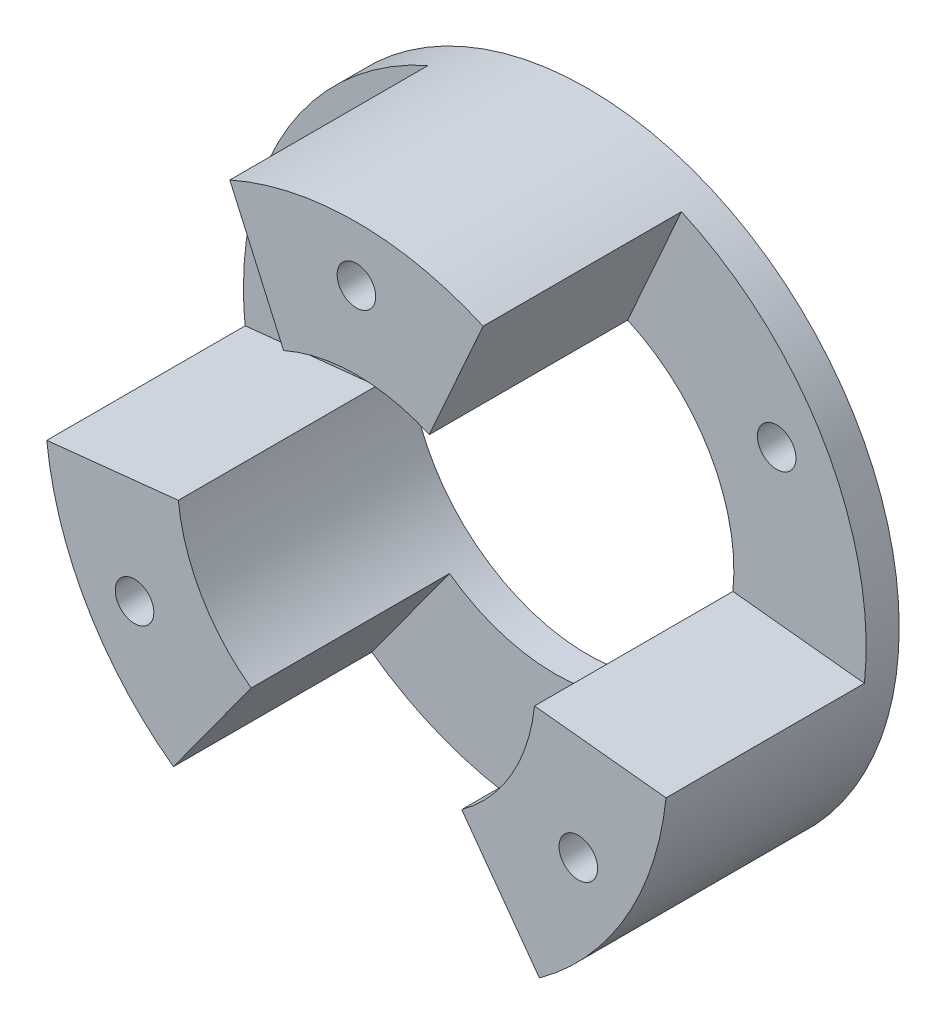
ISO-10303-21;
HEADER;
FILE_DESCRIPTION(('STEP AP214'),'2;1');
FILE_NAME('part.step','',(''),(''),'','','');
FILE_SCHEMA(('AUTOMOTIVE_DESIGN { 1 0 10303 214 1 1 1 1 }'));
ENDSEC;
DATA;
#1=APPLICATION_CONTEXT('core data for automotive mechanical design processes');
#2=APPLICATION_PROTOCOL_DEFINITION('international standard','automotive_design',2000,#1);
#3=PRODUCT_CONTEXT('',#1,'mechanical');
#4=PRODUCT('Part','Part','',(#3));
#5=PRODUCT_RELATED_PRODUCT_CATEGORY('part','',(#4));
#6=PRODUCT_DEFINITION_FORMATION('','',#4);
#7=PRODUCT_DEFINITION_CONTEXT('part definition',#1,'design');
#8=PRODUCT_DEFINITION('design','',#6,#7);
#9=PRODUCT_DEFINITION_SHAPE('','',#8);
#10=(LENGTH_UNIT() NAMED_UNIT(*) SI_UNIT(.MILLI.,.METRE.));
#11=(NAMED_UNIT(*) PLANE_ANGLE_UNIT() SI_UNIT($,.RADIAN.));
#12=(NAMED_UNIT(*) SI_UNIT($,.STERADIAN.) SOLID_ANGLE_UNIT());
#13=UNCERTAINTY_MEASURE_WITH_UNIT(LENGTH_MEASURE(1.E-05),#10,'distance_accuracy_value','');
#14=(GEOMETRIC_REPRESENTATION_CONTEXT(3) GLOBAL_UNCERTAINTY_ASSIGNED_CONTEXT((#13)) GLOBAL_UNIT_ASSIGNED_CONTEXT((#10,
#11,#12)) REPRESENTATION_CONTEXT('',''));
#15=CARTESIAN_POINT('',(0.,0.,0.));
#16=DIRECTION('',(0.,0.,1.));
#17=DIRECTION('',(1.,0.,0.));
#18=AXIS2_PLACEMENT_3D('',#15,#16,#17);
#19=CARTESIAN_POINT('',(0.,28.25,3.));
#20=DIRECTION('',(0.,0.,1.));
#21=DIRECTION('',(1.,0.,0.));
#22=AXIS2_PLACEMENT_3D('',#19,#20,#21);
#23=PLANE('',#22);
#24=CARTESIAN_POINT('',(0.,-23.25,3.));
#25=DIRECTION('',(0.,0.,1.));
#26=DIRECTION('',(1.,0.,0.));
#27=AXIS2_PLACEMENT_3D('',#24,#25,#26);
#28=CIRCLE('',#27,1.75);
#29=CARTESIAN_POINT('',(1.75,-23.25,3.));
#30=VERTEX_POINT('',#29);
#31=EDGE_CURVE('E301',#30,#30,#28,.T.);
#32=ORIENTED_EDGE('',*,*,#31,.F.);
#33=EDGE_LOOP('',(#32));
#34=FACE_BOUND('',#33,.T.);
#35=CARTESIAN_POINT('',(0.,0.,3.));
#36=DIRECTION('',(0.,0.,-1.));
#37=DIRECTION('',(-1.,0.,0.));
#38=AXIS2_PLACEMENT_3D('',#35,#36,#37);
#39=CIRCLE('',#38,16.25);
#40=CARTESIAN_POINT('',(9.55151034975261,-13.146526158593,3.));
#41=VERTEX_POINT('',#40);
#42=CARTESIAN_POINT('',(-9.5515103497528,-13.1465261585928,3.));
#43=VERTEX_POINT('',#42);
#44=EDGE_CURVE('E216',#41,#43,#39,.T.);
#45=ORIENTED_EDGE('',*,*,#44,.T.);
#46=DIRECTION('',(0.58778525229248,0.809016994374942,0.));
#47=VECTOR('',#46,1.);
#48=CARTESIAN_POINT('',(-9.5515103497528,-13.1465261585928,3.));
#49=LINE('',#48,#47);
#50=CARTESIAN_POINT('',(-16.6049333772626,-22.8547300910921,3.));
#51=VERTEX_POINT('',#50);
#52=EDGE_CURVE('E60',#51,#43,#49,.T.);
#53=ORIENTED_EDGE('',*,*,#52,.F.);
#54=CARTESIAN_POINT('',(0.,0.,3.));
#55=DIRECTION('',(0.,0.,-1.));
#56=DIRECTION('',(-1.,0.,0.));
#57=AXIS2_PLACEMENT_3D('',#54,#55,#56);
#58=CIRCLE('',#57,28.25);
#59=CARTESIAN_POINT('',(16.6049333772622,-22.8547300910924,3.));
#60=VERTEX_POINT('',#59);
#61=EDGE_CURVE('E152',#60,#51,#58,.T.);
#62=ORIENTED_EDGE('',*,*,#61,.F.);
#63=DIRECTION('',(0.587785252292469,-0.809016994374951,0.));
#64=VECTOR('',#63,1.);
#65=CARTESIAN_POINT('',(9.55151034975261,-13.146526158593,3.));
#66=LINE('',#65,#64);
#67=EDGE_CURVE('E156',#41,#60,#66,.T.);
#68=ORIENTED_EDGE('',*,*,#67,.F.);
#69=EDGE_LOOP('',(#45,#53,#62,#68));
#70=FACE_BOUND('',#69,.T.);
#71=ADVANCED_FACE('F37',(#34,#70),#23,.T.);
#72=CARTESIAN_POINT('',(-20.1350906379881,11.6250000000001,3.));
#73=DIRECTION('',(0.,0.,1.));
#74=DIRECTION('',(-0.500000000000004,-0.866025403784436,0.));
#75=AXIS2_PLACEMENT_3D('',#72,#73,#74);
#76=CIRCLE('',#75,1.75);
#77=CARTESIAN_POINT('',(-21.0100906379882,10.1094555433773,3.));
#78=VERTEX_POINT('',#77);
#79=EDGE_CURVE('E293',#78,#78,#76,.T.);
#80=ORIENTED_EDGE('',*,*,#79,.F.);
#81=EDGE_LOOP('',(#80));
#82=FACE_BOUND('',#81,.T.);
#83=CARTESIAN_POINT('',(-28.0952435441538,-2.95292908731092,3.));
#84=VERTEX_POINT('',#83);
#85=CARTESIAN_POINT('',(-11.4903101668914,25.8076591784035,3.));
#86=VERTEX_POINT('',#85);
#87=EDGE_CURVE('E52',#84,#86,#58,.T.);
#88=ORIENTED_EDGE('',*,*,#87,.F.);
#89=DIRECTION('',(-0.994521895368274,-0.104528463267644,0.));
#90=VECTOR('',#89,1.);
#91=CARTESIAN_POINT('',(-16.1609807997345,-1.6985875280992,3.));
#92=LINE('',#91,#90);
#93=CARTESIAN_POINT('',(-16.1609807997345,-1.6985875280992,3.));
#94=VERTEX_POINT('',#93);
#95=EDGE_CURVE('E146',#94,#84,#92,.T.);
#96=ORIENTED_EDGE('',*,*,#95,.F.);
#97=CARTESIAN_POINT('',(-6.60947044998177,14.8451136866923,3.));
#98=VERTEX_POINT('',#97);
#99=EDGE_CURVE('E214',#94,#98,#39,.T.);
#100=ORIENTED_EDGE('',*,*,#99,.T.);
#101=DIRECTION('',(0.406736643075801,-0.913545457642601,0.));
#102=VECTOR('',#101,1.);
#103=CARTESIAN_POINT('',(-6.60947044998177,14.8451136866923,3.));
#104=LINE('',#103,#102);
#105=EDGE_CURVE('E184',#86,#98,#104,.T.);
#106=ORIENTED_EDGE('',*,*,#105,.F.);
#107=EDGE_LOOP('',(#88,#96,#100,#106));
#108=FACE_BOUND('',#107,.T.);
#109=ADVANCED_FACE('F221',(#82,#108),#23,.T.);
#110=CARTESIAN_POINT('',(20.1350906379883,11.6249999999998,3.));
#111=DIRECTION('',(0.,0.,1.));
#112=DIRECTION('',(-0.499999999999992,0.866025403784443,0.));
#113=AXIS2_PLACEMENT_3D('',#110,#111,#112);
#114=CIRCLE('',#113,1.75);
#115=CARTESIAN_POINT('',(19.2600906379883,13.1405444566226,3.));
#116=VERTEX_POINT('',#115);
#117=EDGE_CURVE('E288',#116,#116,#114,.T.);
#118=ORIENTED_EDGE('',*,*,#117,.F.);
#119=EDGE_LOOP('',(#118));
#120=FACE_BOUND('',#119,.T.);
#121=CARTESIAN_POINT('',(6.60947044998177,14.8451136866923,3.));
#122=VERTEX_POINT('',#121);
#123=CARTESIAN_POINT('',(16.1609807997344,-1.69858752809943,3.));
#124=VERTEX_POINT('',#123);
#125=EDGE_CURVE('E215',#122,#124,#39,.T.);
#126=ORIENTED_EDGE('',*,*,#125,.T.);
#127=DIRECTION('',(-0.994521895368273,0.104528463267657,0.));
#128=VECTOR('',#127,1.);
#129=CARTESIAN_POINT('',(16.1609807997344,-1.69858752809943,3.));
#130=LINE('',#129,#128);
#131=CARTESIAN_POINT('',(28.0952435441537,-2.95292908731132,3.));
#132=VERTEX_POINT('',#131);
#133=EDGE_CURVE('E153',#132,#124,#130,.T.);
#134=ORIENTED_EDGE('',*,*,#133,.F.);
#135=CARTESIAN_POINT('',(11.4903101668914,25.8076591784035,3.));
#136=VERTEX_POINT('',#135);
#137=EDGE_CURVE('E45',#136,#132,#58,.T.);
#138=ORIENTED_EDGE('',*,*,#137,.F.);
#139=DIRECTION('',(0.406736643075801,0.913545457642601,0.));
#140=VECTOR('',#139,1.);
#141=CARTESIAN_POINT('',(6.60947044998177,14.8451136866923,3.));
#142=LINE('',#141,#140);
#143=EDGE_CURVE('E189',#122,#136,#142,.T.);
#144=ORIENTED_EDGE('',*,*,#143,.F.);
#145=EDGE_LOOP('',(#126,#134,#138,#144));
#146=FACE_BOUND('',#145,.T.);
#147=ADVANCED_FACE('F235',(#120,#146),#23,.T.);
#148=CARTESIAN_POINT('',(0.,16.25,0.));
#149=DIRECTION('',(0.,0.,-1.));
#150=DIRECTION('',(-1.,0.,0.));
#151=AXIS2_PLACEMENT_3D('',#148,#149,#150);
#152=PLANE('',#151);
#153=CARTESIAN_POINT('',(-20.1350906379881,11.6250000000001,0.));
#154=DIRECTION('',(0.,0.,1.));
#155=DIRECTION('',(-0.500000000000004,-0.866025403784436,0.));
#156=AXIS2_PLACEMENT_3D('',#153,#154,#155);
#157=CIRCLE('',#156,1.75);
#158=CARTESIAN_POINT('',(-21.0100906379882,10.1094555433773,0.));
#159=VERTEX_POINT('',#158);
#160=EDGE_CURVE('E304',#159,#159,#157,.T.);
#161=ORIENTED_EDGE('',*,*,#160,.T.);
#162=EDGE_LOOP('',(#161));
#163=FACE_BOUND('',#162,.T.);
#164=CARTESIAN_POINT('',(20.1350906379883,11.6249999999998,0.));
#165=DIRECTION('',(0.,0.,1.));
#166=DIRECTION('',(-0.499999999999992,0.866025403784443,0.));
#167=AXIS2_PLACEMENT_3D('',#164,#165,#166);
#168=CIRCLE('',#167,1.75);
#169=CARTESIAN_POINT('',(19.2600906379883,13.1405444566226,0.));
#170=VERTEX_POINT('',#169);
#171=EDGE_CURVE('E290',#170,#170,#168,.T.);
#172=ORIENTED_EDGE('',*,*,#171,.T.);
#173=EDGE_LOOP('',(#172));
#174=FACE_BOUND('',#173,.T.);
#175=CARTESIAN_POINT('',(0.,-23.25,0.));
#176=DIRECTION('',(0.,0.,1.));
#177=DIRECTION('',(1.,0.,0.));
#178=AXIS2_PLACEMENT_3D('',#175,#176,#177);
#179=CIRCLE('',#178,1.75);
#180=CARTESIAN_POINT('',(1.75,-23.25,0.));
#181=VERTEX_POINT('',#180);
#182=EDGE_CURVE('E297',#181,#181,#179,.T.);
#183=ORIENTED_EDGE('',*,*,#182,.T.);
#184=EDGE_LOOP('',(#183));
#185=FACE_BOUND('',#184,.T.);
#186=CARTESIAN_POINT('',(0.,0.,0.));
#187=DIRECTION('',(0.,0.,-1.));
#188=DIRECTION('',(-1.,0.,0.));
#189=AXIS2_PLACEMENT_3D('',#186,#187,#188);
#190=CIRCLE('',#189,28.25);
#191=CARTESIAN_POINT('',(-28.25,0.,0.));
#192=VERTEX_POINT('',#191);
#193=EDGE_CURVE('E11',#192,#192,#190,.T.);
#194=ORIENTED_EDGE('',*,*,#193,.T.);
#195=EDGE_LOOP('',(#194));
#196=FACE_BOUND('',#195,.T.);
#197=CARTESIAN_POINT('',(0.,0.,0.));
#198=DIRECTION('',(0.,0.,-1.));
#199=DIRECTION('',(-1.,0.,0.));
#200=AXIS2_PLACEMENT_3D('',#197,#198,#199);
#201=CIRCLE('',#200,16.25);
#202=CARTESIAN_POINT('',(-16.25,0.,0.));
#203=VERTEX_POINT('',#202);
#204=EDGE_CURVE('E211',#203,#203,#201,.T.);
#205=ORIENTED_EDGE('',*,*,#204,.F.);
#206=EDGE_LOOP('',(#205));
#207=FACE_BOUND('',#206,.T.);
#208=ADVANCED_FACE('F39',(#163,#174,#185,#196,#207),#152,.T.);
#209=CARTESIAN_POINT('',(0.,0.,0.));
#210=DIRECTION('',(0.,0.,-1.));
#211=DIRECTION('',(-1.,0.,0.));
#212=AXIS2_PLACEMENT_3D('',#209,#210,#211);
#213=CYLINDRICAL_SURFACE('',#212,28.25);
#214=ORIENTED_EDGE('',*,*,#137,.T.);
#215=DIRECTION('',(0.,0.,-1.));
#216=VECTOR('',#215,1.);
#217=CARTESIAN_POINT('',(28.0952435441537,-2.95292908731132,21.));
#218=LINE('',#217,#216);
#219=CARTESIAN_POINT('',(28.0952435441537,-2.95292908731132,21.));
#220=VERTEX_POINT('',#219);
#221=EDGE_CURVE('E181',#220,#132,#218,.T.);
#222=ORIENTED_EDGE('',*,*,#221,.F.);
#223=CARTESIAN_POINT('',(0.,0.,21.));
#224=DIRECTION('',(0.,0.,1.));
#225=DIRECTION('',(-0.500000000000004,-0.866025403784436,0.));
#226=AXIS2_PLACEMENT_3D('',#223,#224,#225);
#227=CIRCLE('',#226,28.25);
#228=CARTESIAN_POINT('',(16.6049333772622,-22.8547300910924,21.));
#229=VERTEX_POINT('',#228);
#230=EDGE_CURVE('E162',#229,#220,#227,.T.);
#231=ORIENTED_EDGE('',*,*,#230,.F.);
#232=DIRECTION('',(0.,0.,-1.));
#233=VECTOR('',#232,1.);
#234=CARTESIAN_POINT('',(16.6049333772622,-22.8547300910924,21.));
#235=LINE('',#234,#233);
#236=EDGE_CURVE('E170',#229,#60,#235,.T.);
#237=ORIENTED_EDGE('',*,*,#236,.T.);
#238=ORIENTED_EDGE('',*,*,#61,.T.);
#239=DIRECTION('',(0.,0.,-1.));
#240=VECTOR('',#239,1.);
#241=CARTESIAN_POINT('',(-16.6049333772626,-22.8547300910921,21.));
#242=LINE('',#241,#240);
#243=CARTESIAN_POINT('',(-16.6049333772626,-22.8547300910921,21.));
#244=VERTEX_POINT('',#243);
#245=EDGE_CURVE('E131',#244,#51,#242,.T.);
#246=ORIENTED_EDGE('',*,*,#245,.F.);
#247=CARTESIAN_POINT('',(0.,0.,21.));
#248=DIRECTION('',(0.,0.,1.));
#249=DIRECTION('',(-0.499999999999992,0.866025403784443,0.));
#250=AXIS2_PLACEMENT_3D('',#247,#248,#249);
#251=CIRCLE('',#250,28.25);
#252=CARTESIAN_POINT('',(-28.0952435441538,-2.95292908731092,21.));
#253=VERTEX_POINT('',#252);
#254=EDGE_CURVE('E137',#253,#244,#251,.T.);
#255=ORIENTED_EDGE('',*,*,#254,.F.);
#256=DIRECTION('',(0.,0.,-1.));
#257=VECTOR('',#256,1.);
#258=CARTESIAN_POINT('',(-28.0952435441538,-2.95292908731092,21.));
#259=LINE('',#258,#257);
#260=EDGE_CURVE('E220',#253,#84,#259,.T.);
#261=ORIENTED_EDGE('',*,*,#260,.T.);
#262=ORIENTED_EDGE('',*,*,#87,.T.);
#263=DIRECTION('',(0.,0.,-1.));
#264=VECTOR('',#263,1.);
#265=CARTESIAN_POINT('',(-11.4903101668914,25.8076591784035,21.));
#266=LINE('',#265,#264);
#267=CARTESIAN_POINT('',(-11.4903101668914,25.8076591784035,21.));
#268=VERTEX_POINT('',#267);
#269=EDGE_CURVE('E208',#268,#86,#266,.T.);
#270=ORIENTED_EDGE('',*,*,#269,.F.);
#271=CARTESIAN_POINT('',(0.,0.,21.));
#272=DIRECTION('',(0.,0.,1.));
#273=DIRECTION('',(1.,0.,0.));
#274=AXIS2_PLACEMENT_3D('',#271,#272,#273);
#275=CIRCLE('',#274,28.25);
#276=CARTESIAN_POINT('',(11.4903101668914,25.8076591784035,21.));
#277=VERTEX_POINT('',#276);
#278=EDGE_CURVE('E185',#277,#268,#275,.T.);
#279=ORIENTED_EDGE('',*,*,#278,.F.);
#280=DIRECTION('',(0.,0.,-1.));
#281=VECTOR('',#280,1.);
#282=CARTESIAN_POINT('',(11.4903101668914,25.8076591784035,21.));
#283=LINE('',#282,#281);
#284=EDGE_CURVE('E195',#277,#136,#283,.T.);
#285=ORIENTED_EDGE('',*,*,#284,.T.);
#286=EDGE_LOOP('',(#214,#222,#231,#237,#238,#246,#255,#261,#262,#270,#279,#285));
#287=FACE_BOUND('',#286,.T.);
#288=ORIENTED_EDGE('',*,*,#193,.F.);
#289=EDGE_LOOP('',(#288));
#290=FACE_BOUND('',#289,.T.);
#291=ADVANCED_FACE('F149',(#287,#290),#213,.T.);
#292=CARTESIAN_POINT('',(0.,0.,0.));
#293=DIRECTION('',(0.,0.,-1.));
#294=DIRECTION('',(-1.,0.,0.));
#295=AXIS2_PLACEMENT_3D('',#292,#293,#294);
#296=CYLINDRICAL_SURFACE('',#295,16.25);
#297=ORIENTED_EDGE('',*,*,#204,.T.);
#298=EDGE_LOOP('',(#297));
#299=FACE_BOUND('',#298,.T.);
#300=ORIENTED_EDGE('',*,*,#125,.F.);
#301=DIRECTION('',(0.,0.,-1.));
#302=VECTOR('',#301,1.);
#303=CARTESIAN_POINT('',(6.60947044998177,14.8451136866923,21.));
#304=LINE('',#303,#302);
#305=CARTESIAN_POINT('',(6.60947044998177,14.8451136866923,21.));
#306=VERTEX_POINT('',#305);
#307=EDGE_CURVE('E202',#306,#122,#304,.T.);
#308=ORIENTED_EDGE('',*,*,#307,.F.);
#309=CARTESIAN_POINT('',(0.,0.,21.));
#310=DIRECTION('',(0.,0.,-1.));
#311=DIRECTION('',(1.,0.,0.));
#312=AXIS2_PLACEMENT_3D('',#309,#310,#311);
#313=CIRCLE('',#312,16.25);
#314=CARTESIAN_POINT('',(-6.60947044998177,14.8451136866923,21.));
#315=VERTEX_POINT('',#314);
#316=EDGE_CURVE('E191',#315,#306,#313,.T.);
#317=ORIENTED_EDGE('',*,*,#316,.F.);
#318=DIRECTION('',(0.,0.,-1.));
#319=VECTOR('',#318,1.);
#320=CARTESIAN_POINT('',(-6.60947044998177,14.8451136866923,21.));
#321=LINE('',#320,#319);
#322=EDGE_CURVE('E205',#315,#98,#321,.T.);
#323=ORIENTED_EDGE('',*,*,#322,.T.);
#324=ORIENTED_EDGE('',*,*,#99,.F.);
#325=DIRECTION('',(0.,0.,-1.));
#326=VECTOR('',#325,1.);
#327=CARTESIAN_POINT('',(-16.1609807997345,-1.6985875280992,21.));
#328=LINE('',#327,#326);
#329=CARTESIAN_POINT('',(-16.1609807997345,-1.6985875280992,21.));
#330=VERTEX_POINT('',#329);
#331=EDGE_CURVE('E158',#330,#94,#328,.T.);
#332=ORIENTED_EDGE('',*,*,#331,.F.);
#333=CARTESIAN_POINT('',(0.,0.,21.));
#334=DIRECTION('',(0.,0.,-1.));
#335=DIRECTION('',(-0.499999999999992,0.866025403784443,0.));
#336=AXIS2_PLACEMENT_3D('',#333,#334,#335);
#337=CIRCLE('',#336,16.25);
#338=CARTESIAN_POINT('',(-9.5515103497528,-13.1465261585928,21.));
#339=VERTEX_POINT('',#338);
#340=EDGE_CURVE('E136',#339,#330,#337,.T.);
#341=ORIENTED_EDGE('',*,*,#340,.F.);
#342=DIRECTION('',(0.,0.,-1.));
#343=VECTOR('',#342,1.);
#344=CARTESIAN_POINT('',(-9.5515103497528,-13.1465261585928,21.));
#345=LINE('',#344,#343);
#346=EDGE_CURVE('E133',#339,#43,#345,.T.);
#347=ORIENTED_EDGE('',*,*,#346,.T.);
#348=ORIENTED_EDGE('',*,*,#44,.F.);
#349=DIRECTION('',(0.,0.,-1.));
#350=VECTOR('',#349,1.);
#351=CARTESIAN_POINT('',(9.55151034975261,-13.146526158593,21.));
#352=LINE('',#351,#350);
#353=CARTESIAN_POINT('',(9.55151034975261,-13.146526158593,21.));
#354=VERTEX_POINT('',#353);
#355=EDGE_CURVE('E175',#354,#41,#352,.T.);
#356=ORIENTED_EDGE('',*,*,#355,.F.);
#357=CARTESIAN_POINT('',(0.,0.,21.));
#358=DIRECTION('',(0.,0.,-1.));
#359=DIRECTION('',(-0.500000000000004,-0.866025403784436,0.));
#360=AXIS2_PLACEMENT_3D('',#357,#358,#359);
#361=CIRCLE('',#360,16.25);
#362=CARTESIAN_POINT('',(16.1609807997344,-1.69858752809943,21.));
#363=VERTEX_POINT('',#362);
#364=EDGE_CURVE('E167',#363,#354,#361,.T.);
#365=ORIENTED_EDGE('',*,*,#364,.F.);
#366=DIRECTION('',(0.,0.,-1.));
#367=VECTOR('',#366,1.);
#368=CARTESIAN_POINT('',(16.1609807997344,-1.69858752809943,21.));
#369=LINE('',#368,#367);
#370=EDGE_CURVE('E178',#363,#124,#369,.T.);
#371=ORIENTED_EDGE('',*,*,#370,.T.);
#372=EDGE_LOOP('',(#300,#308,#317,#323,#324,#332,#341,#347,#348,#356,#365,#371));
#373=FACE_BOUND('',#372,.T.);
#374=ADVANCED_FACE('F237',(#299,#373),#296,.F.);
#375=CARTESIAN_POINT('',(-6.60947044998177,14.8451136866923,21.));
#376=DIRECTION('',(0.913545457642601,0.406736643075801,0.));
#377=DIRECTION('',(-0.406736643075801,0.913545457642601,0.));
#378=AXIS2_PLACEMENT_3D('',#375,#376,#377);
#379=PLANE('',#378);
#380=ORIENTED_EDGE('',*,*,#105,.T.);
#381=ORIENTED_EDGE('',*,*,#322,.F.);
#382=DIRECTION('',(0.406736643075801,-0.913545457642601,0.));
#383=VECTOR('',#382,1.);
#384=CARTESIAN_POINT('',(-6.60947044998177,14.8451136866923,21.));
#385=LINE('',#384,#383);
#386=EDGE_CURVE('E188',#268,#315,#385,.T.);
#387=ORIENTED_EDGE('',*,*,#386,.F.);
#388=ORIENTED_EDGE('',*,*,#269,.T.);
#389=EDGE_LOOP('',(#380,#381,#387,#388));
#390=FACE_BOUND('',#389,.T.);
#391=ADVANCED_FACE('F224',(#390),#379,.F.);
#392=CARTESIAN_POINT('',(6.60947044998177,14.8451136866923,21.));
#393=DIRECTION('',(-0.913545457642601,0.406736643075801,0.));
#394=DIRECTION('',(-0.406736643075801,-0.913545457642601,0.));
#395=AXIS2_PLACEMENT_3D('',#392,#393,#394);
#396=PLANE('',#395);
#397=ORIENTED_EDGE('',*,*,#143,.T.);
#398=ORIENTED_EDGE('',*,*,#284,.F.);
#399=DIRECTION('',(0.406736643075801,0.913545457642601,0.));
#400=VECTOR('',#399,1.);
#401=CARTESIAN_POINT('',(6.60947044998177,14.8451136866923,21.));
#402=LINE('',#401,#400);
#403=EDGE_CURVE('E193',#306,#277,#402,.T.);
#404=ORIENTED_EDGE('',*,*,#403,.F.);
#405=ORIENTED_EDGE('',*,*,#307,.T.);
#406=EDGE_LOOP('',(#397,#398,#404,#405));
#407=FACE_BOUND('',#406,.T.);
#408=ADVANCED_FACE('F231',(#407),#396,.F.);
#409=CARTESIAN_POINT('',(0.,0.,21.));
#410=DIRECTION('',(0.,0.,1.));
#411=DIRECTION('',(1.,0.,0.));
#412=AXIS2_PLACEMENT_3D('',#409,#410,#411);
#413=PLANE('',#412);
#414=CARTESIAN_POINT('',(0.,23.25,21.));
#415=DIRECTION('',(0.,0.,1.));
#416=DIRECTION('',(1.,0.,0.));
#417=AXIS2_PLACEMENT_3D('',#414,#415,#416);
#418=CIRCLE('',#417,1.75);
#419=CARTESIAN_POINT('',(1.75,23.25,21.));
#420=VERTEX_POINT('',#419);
#421=EDGE_CURVE('E308',#420,#420,#418,.T.);
#422=ORIENTED_EDGE('',*,*,#421,.F.);
#423=EDGE_LOOP('',(#422));
#424=FACE_BOUND('',#423,.T.);
#425=ORIENTED_EDGE('',*,*,#278,.T.);
#426=ORIENTED_EDGE('',*,*,#386,.T.);
#427=ORIENTED_EDGE('',*,*,#316,.T.);
#428=ORIENTED_EDGE('',*,*,#403,.T.);
#429=EDGE_LOOP('',(#425,#426,#427,#428));
#430=FACE_BOUND('',#429,.T.);
#431=ADVANCED_FACE('F227',(#424,#430),#413,.T.);
#432=CARTESIAN_POINT('',(16.1609807997344,-1.69858752809943,21.));
#433=DIRECTION('',(-0.104528463267657,-0.994521895368273,0.));
#434=DIRECTION('',(0.994521895368273,-0.104528463267657,0.));
#435=AXIS2_PLACEMENT_3D('',#432,#433,#434);
#436=PLANE('',#435);
#437=ORIENTED_EDGE('',*,*,#133,.T.);
#438=ORIENTED_EDGE('',*,*,#370,.F.);
#439=DIRECTION('',(-0.994521895368273,0.104528463267657,0.));
#440=VECTOR('',#439,1.);
#441=CARTESIAN_POINT('',(16.1609807997344,-1.69858752809943,21.));
#442=LINE('',#441,#440);
#443=EDGE_CURVE('E165',#220,#363,#442,.T.);
#444=ORIENTED_EDGE('',*,*,#443,.F.);
#445=ORIENTED_EDGE('',*,*,#221,.T.);
#446=EDGE_LOOP('',(#437,#438,#444,#445));
#447=FACE_BOUND('',#446,.T.);
#448=ADVANCED_FACE('F242',(#447),#436,.F.);
#449=CARTESIAN_POINT('',(9.55151034975261,-13.146526158593,21.));
#450=DIRECTION('',(0.809016994374951,0.587785252292469,0.));
#451=DIRECTION('',(-0.587785252292469,0.809016994374951,0.));
#452=AXIS2_PLACEMENT_3D('',#449,#450,#451);
#453=PLANE('',#452);
#454=ORIENTED_EDGE('',*,*,#67,.T.);
#455=ORIENTED_EDGE('',*,*,#236,.F.);
#456=DIRECTION('',(0.587785252292469,-0.809016994374951,0.));
#457=VECTOR('',#456,1.);
#458=CARTESIAN_POINT('',(9.55151034975261,-13.146526158593,21.));
#459=LINE('',#458,#457);
#460=EDGE_CURVE('E169',#354,#229,#459,.T.);
#461=ORIENTED_EDGE('',*,*,#460,.F.);
#462=ORIENTED_EDGE('',*,*,#355,.T.);
#463=EDGE_LOOP('',(#454,#455,#461,#462));
#464=FACE_BOUND('',#463,.T.);
#465=ADVANCED_FACE('F249',(#464),#453,.F.);
#466=CARTESIAN_POINT('',(0.,0.,21.));
#467=DIRECTION('',(0.,0.,1.));
#468=DIRECTION('',(-0.500000000000004,-0.866025403784436,0.));
#469=AXIS2_PLACEMENT_3D('',#466,#467,#468);
#470=PLANE('',#469);
#471=CARTESIAN_POINT('',(20.1350906379881,-11.6250000000001,21.));
#472=DIRECTION('',(0.,0.,1.));
#473=DIRECTION('',(-0.500000000000004,-0.866025403784436,0.));
#474=AXIS2_PLACEMENT_3D('',#471,#472,#473);
#475=CIRCLE('',#474,1.75);
#476=CARTESIAN_POINT('',(19.2600906379881,-13.1405444566229,21.));
#477=VERTEX_POINT('',#476);
#478=EDGE_CURVE('E309',#477,#477,#475,.T.);
#479=ORIENTED_EDGE('',*,*,#478,.F.);
#480=EDGE_LOOP('',(#479));
#481=FACE_BOUND('',#480,.T.);
#482=ORIENTED_EDGE('',*,*,#230,.T.);
#483=ORIENTED_EDGE('',*,*,#443,.T.);
#484=ORIENTED_EDGE('',*,*,#364,.T.);
#485=ORIENTED_EDGE('',*,*,#460,.T.);
#486=EDGE_LOOP('',(#482,#483,#484,#485));
#487=FACE_BOUND('',#486,.T.);
#488=ADVANCED_FACE('F246',(#481,#487),#470,.T.);
#489=CARTESIAN_POINT('',(-9.5515103497528,-13.1465261585928,21.));
#490=DIRECTION('',(-0.809016994374942,0.58778525229248,0.));
#491=DIRECTION('',(-0.58778525229248,-0.809016994374943,0.));
#492=AXIS2_PLACEMENT_3D('',#489,#490,#491);
#493=PLANE('',#492);
#494=ORIENTED_EDGE('',*,*,#52,.T.);
#495=ORIENTED_EDGE('',*,*,#346,.F.);
#496=DIRECTION('',(0.58778525229248,0.809016994374942,0.));
#497=VECTOR('',#496,1.);
#498=CARTESIAN_POINT('',(-9.5515103497528,-13.1465261585928,21.));
#499=LINE('',#498,#497);
#500=EDGE_CURVE('E127',#244,#339,#499,.T.);
#501=ORIENTED_EDGE('',*,*,#500,.F.);
#502=ORIENTED_EDGE('',*,*,#245,.T.);
#503=EDGE_LOOP('',(#494,#495,#501,#502));
#504=FACE_BOUND('',#503,.T.);
#505=ADVANCED_FACE('F129',(#504),#493,.F.);
#506=CARTESIAN_POINT('',(-16.1609807997345,-1.6985875280992,21.));
#507=DIRECTION('',(0.104528463267644,-0.994521895368274,0.));
#508=DIRECTION('',(0.994521895368275,0.104528463267644,0.));
#509=AXIS2_PLACEMENT_3D('',#506,#507,#508);
#510=PLANE('',#509);
#511=ORIENTED_EDGE('',*,*,#95,.T.);
#512=ORIENTED_EDGE('',*,*,#260,.F.);
#513=DIRECTION('',(-0.994521895368274,-0.104528463267644,0.));
#514=VECTOR('',#513,1.);
#515=CARTESIAN_POINT('',(-16.1609807997345,-1.6985875280992,21.));
#516=LINE('',#515,#514);
#517=EDGE_CURVE('E142',#330,#253,#516,.T.);
#518=ORIENTED_EDGE('',*,*,#517,.F.);
#519=ORIENTED_EDGE('',*,*,#331,.T.);
#520=EDGE_LOOP('',(#511,#512,#518,#519));
#521=FACE_BOUND('',#520,.T.);
#522=ADVANCED_FACE('F260',(#521),#510,.F.);
#523=CARTESIAN_POINT('',(0.,0.,21.));
#524=DIRECTION('',(0.,0.,1.));
#525=DIRECTION('',(-0.499999999999992,0.866025403784443,0.));
#526=AXIS2_PLACEMENT_3D('',#523,#524,#525);
#527=PLANE('',#526);
#528=CARTESIAN_POINT('',(-20.1350906379883,-11.6249999999998,21.));
#529=DIRECTION('',(0.,0.,1.));
#530=DIRECTION('',(-0.499999999999992,0.866025403784443,0.));
#531=AXIS2_PLACEMENT_3D('',#528,#529,#530);
#532=CIRCLE('',#531,1.75);
#533=CARTESIAN_POINT('',(-21.0100906379883,-10.109455543377,21.));
#534=VERTEX_POINT('',#533);
#535=EDGE_CURVE('E300',#534,#534,#532,.T.);
#536=ORIENTED_EDGE('',*,*,#535,.F.);
#537=EDGE_LOOP('',(#536));
#538=FACE_BOUND('',#537,.T.);
#539=ORIENTED_EDGE('',*,*,#254,.T.);
#540=ORIENTED_EDGE('',*,*,#500,.T.);
#541=ORIENTED_EDGE('',*,*,#340,.T.);
#542=ORIENTED_EDGE('',*,*,#517,.T.);
#543=EDGE_LOOP('',(#539,#540,#541,#542));
#544=FACE_BOUND('',#543,.T.);
#545=ADVANCED_FACE('F140',(#538,#544),#527,.T.);
#546=CARTESIAN_POINT('',(0.,23.25,9.));
#547=DIRECTION('',(0.,0.,1.));
#548=DIRECTION('',(1.,0.,0.));
#549=AXIS2_PLACEMENT_3D('',#546,#547,#548);
#550=CYLINDRICAL_SURFACE('',#549,1.75);
#551=CARTESIAN_POINT('',(0.,23.25,9.));
#552=DIRECTION('',(0.,0.,1.));
#553=DIRECTION('',(1.,0.,0.));
#554=AXIS2_PLACEMENT_3D('',#551,#552,#553);
#555=CIRCLE('',#554,1.75);
#556=CARTESIAN_POINT('',(1.75,23.25,9.));
#557=VERTEX_POINT('',#556);
#558=EDGE_CURVE('E251',#557,#557,#555,.T.);
#559=ORIENTED_EDGE('',*,*,#558,.F.);
#560=EDGE_LOOP('',(#559));
#561=FACE_BOUND('',#560,.T.);
#562=ORIENTED_EDGE('',*,*,#421,.T.);
#563=EDGE_LOOP('',(#562));
#564=FACE_BOUND('',#563,.T.);
#565=ADVANCED_FACE('F267',(#561,#564),#550,.F.);
#566=CARTESIAN_POINT('',(0.,23.25,9.));
#567=DIRECTION('',(0.,0.,1.));
#568=DIRECTION('',(1.,0.,0.));
#569=AXIS2_PLACEMENT_3D('',#566,#567,#568);
#570=PLANE('',#569);
#571=ORIENTED_EDGE('',*,*,#558,.T.);
#572=EDGE_LOOP('',(#571));
#573=FACE_BOUND('',#572,.T.);
#574=ADVANCED_FACE('F427',(#573),#570,.T.);
#575=CARTESIAN_POINT('',(-20.1350906379883,-11.6249999999998,9.));
#576=DIRECTION('',(0.,0.,1.));
#577=DIRECTION('',(1.,0.,0.));
#578=AXIS2_PLACEMENT_3D('',#575,#576,#577);
#579=CYLINDRICAL_SURFACE('',#578,1.75);
#580=CARTESIAN_POINT('',(-20.1350906379883,-11.6249999999998,9.));
#581=DIRECTION('',(0.,0.,1.));
#582=DIRECTION('',(-0.499999999999992,0.866025403784443,0.));
#583=AXIS2_PLACEMENT_3D('',#580,#581,#582);
#584=CIRCLE('',#583,1.75);
#585=CARTESIAN_POINT('',(-21.0100906379883,-10.109455543377,9.));
#586=VERTEX_POINT('',#585);
#587=EDGE_CURVE('E312',#586,#586,#584,.T.);
#588=ORIENTED_EDGE('',*,*,#587,.F.);
#589=EDGE_LOOP('',(#588));
#590=FACE_BOUND('',#589,.T.);
#591=ORIENTED_EDGE('',*,*,#535,.T.);
#592=EDGE_LOOP('',(#591));
#593=FACE_BOUND('',#592,.T.);
#594=ADVANCED_FACE('F417',(#590,#593),#579,.F.);
#595=CARTESIAN_POINT('',(-20.1350906379883,-11.6249999999998,9.));
#596=DIRECTION('',(0.,0.,1.));
#597=DIRECTION('',(-0.499999999999992,0.866025403784443,0.));
#598=AXIS2_PLACEMENT_3D('',#595,#596,#597);
#599=PLANE('',#598);
#600=ORIENTED_EDGE('',*,*,#587,.T.);
#601=EDGE_LOOP('',(#600));
#602=FACE_BOUND('',#601,.T.);
#603=ADVANCED_FACE('F407',(#602),#599,.T.);
#604=CARTESIAN_POINT('',(20.1350906379881,-11.6250000000001,9.));
#605=DIRECTION('',(0.,0.,1.));
#606=DIRECTION('',(1.,0.,0.));
#607=AXIS2_PLACEMENT_3D('',#604,#605,#606);
#608=CYLINDRICAL_SURFACE('',#607,1.75);
#609=CARTESIAN_POINT('',(20.1350906379881,-11.6250000000001,9.));
#610=DIRECTION('',(0.,0.,1.));
#611=DIRECTION('',(-0.500000000000004,-0.866025403784436,0.));
#612=AXIS2_PLACEMENT_3D('',#609,#610,#611);
#613=CIRCLE('',#612,1.75);
#614=CARTESIAN_POINT('',(19.2600906379881,-13.1405444566229,9.));
#615=VERTEX_POINT('',#614);
#616=EDGE_CURVE('E305',#615,#615,#613,.T.);
#617=ORIENTED_EDGE('',*,*,#616,.F.);
#618=EDGE_LOOP('',(#617));
#619=FACE_BOUND('',#618,.T.);
#620=ORIENTED_EDGE('',*,*,#478,.T.);
#621=EDGE_LOOP('',(#620));
#622=FACE_BOUND('',#621,.T.);
#623=ADVANCED_FACE('F397',(#619,#622),#608,.F.);
#624=CARTESIAN_POINT('',(20.1350906379881,-11.6250000000001,9.));
#625=DIRECTION('',(0.,0.,1.));
#626=DIRECTION('',(-0.500000000000004,-0.866025403784436,0.));
#627=AXIS2_PLACEMENT_3D('',#624,#625,#626);
#628=PLANE('',#627);
#629=ORIENTED_EDGE('',*,*,#616,.T.);
#630=EDGE_LOOP('',(#629));
#631=FACE_BOUND('',#630,.T.);
#632=ADVANCED_FACE('F387',(#631),#628,.T.);
#633=CARTESIAN_POINT('',(0.,-23.25,0.));
#634=DIRECTION('',(0.,0.,1.));
#635=DIRECTION('',(1.,0.,0.));
#636=AXIS2_PLACEMENT_3D('',#633,#634,#635);
#637=CYLINDRICAL_SURFACE('',#636,1.75);
#638=ORIENTED_EDGE('',*,*,#182,.F.);
#639=EDGE_LOOP('',(#638));
#640=FACE_BOUND('',#639,.T.);
#641=ORIENTED_EDGE('',*,*,#31,.T.);
#642=EDGE_LOOP('',(#641));
#643=FACE_BOUND('',#642,.T.);
#644=ADVANCED_FACE('F364',(#640,#643),#637,.F.);
#645=CARTESIAN_POINT('',(20.1350906379883,11.6249999999998,0.));
#646=DIRECTION('',(0.,0.,1.));
#647=DIRECTION('',(1.,0.,0.));
#648=AXIS2_PLACEMENT_3D('',#645,#646,#647);
#649=CYLINDRICAL_SURFACE('',#648,1.75);
#650=ORIENTED_EDGE('',*,*,#171,.F.);
#651=EDGE_LOOP('',(#650));
#652=FACE_BOUND('',#651,.T.);
#653=ORIENTED_EDGE('',*,*,#117,.T.);
#654=EDGE_LOOP('',(#653));
#655=FACE_BOUND('',#654,.T.);
#656=ADVANCED_FACE('F358',(#652,#655),#649,.F.);
#657=CARTESIAN_POINT('',(-20.1350906379881,11.6250000000001,0.));
#658=DIRECTION('',(0.,0.,1.));
#659=DIRECTION('',(1.,0.,0.));
#660=AXIS2_PLACEMENT_3D('',#657,#658,#659);
#661=CYLINDRICAL_SURFACE('',#660,1.75);
#662=ORIENTED_EDGE('',*,*,#160,.F.);
#663=EDGE_LOOP('',(#662));
#664=FACE_BOUND('',#663,.T.);
#665=ORIENTED_EDGE('',*,*,#79,.T.);
#666=EDGE_LOOP('',(#665));
#667=FACE_BOUND('',#666,.T.);
#668=ADVANCED_FACE('F363',(#664,#667),#661,.F.);
#669=CLOSED_SHELL('',(#71,#109,#147,#208,#291,#374,#391,#408,#431,#448,#465,#488,#505,#522,#545,
#565,#574,#594,#603,#623,#632,#644,#656,#668));
#670=MANIFOLD_SOLID_BREP('B2',#669);
#671=ADVANCED_BREP_SHAPE_REPRESENTATION('',(#18,#670),#14);
#672=SHAPE_DEFINITION_REPRESENTATION(#9,#671);
ENDSEC;
END-ISO-10303-21;
